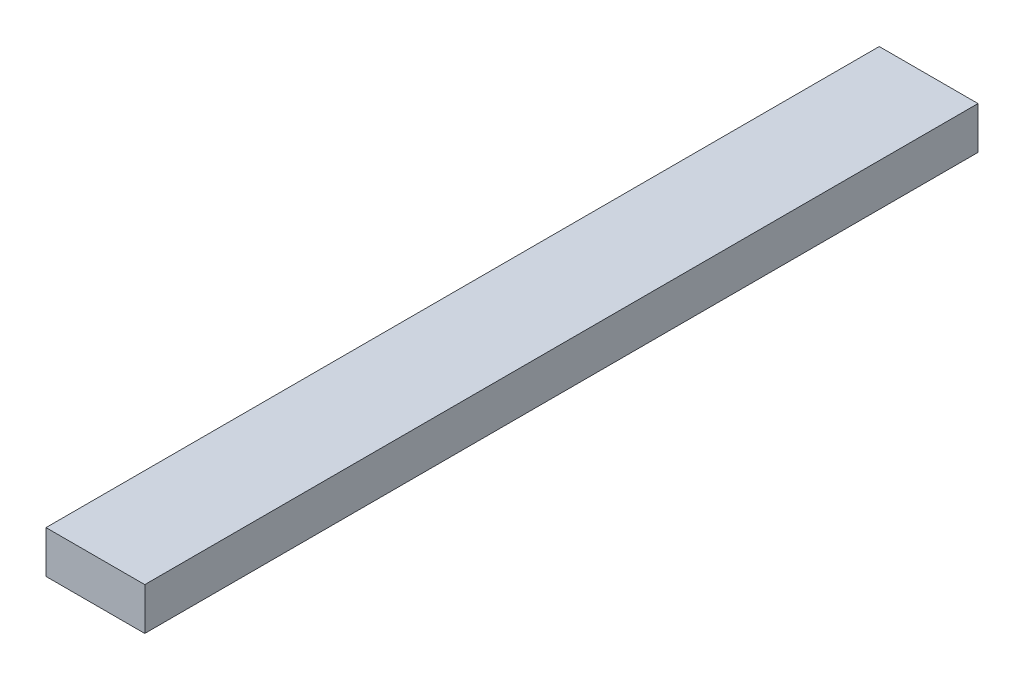
ISO-10303-21;
HEADER;
FILE_DESCRIPTION(('STEP AP214'),'2;1');
FILE_NAME('part.step','',(''),(''),'','','');
FILE_SCHEMA(('AUTOMOTIVE_DESIGN { 1 0 10303 214 1 1 1 1 }'));
ENDSEC;
DATA;
#1=APPLICATION_CONTEXT('core data for automotive mechanical design processes');
#2=APPLICATION_PROTOCOL_DEFINITION('international standard','automotive_design',2000,#1);
#3=PRODUCT_CONTEXT('',#1,'mechanical');
#4=PRODUCT('Part','Part','',(#3));
#5=PRODUCT_RELATED_PRODUCT_CATEGORY('part','',(#4));
#6=PRODUCT_DEFINITION_FORMATION('','',#4);
#7=PRODUCT_DEFINITION_CONTEXT('part definition',#1,'design');
#8=PRODUCT_DEFINITION('design','',#6,#7);
#9=PRODUCT_DEFINITION_SHAPE('','',#8);
#10=(LENGTH_UNIT() NAMED_UNIT(*) SI_UNIT(.MILLI.,.METRE.));
#11=(NAMED_UNIT(*) PLANE_ANGLE_UNIT() SI_UNIT($,.RADIAN.));
#12=(NAMED_UNIT(*) SI_UNIT($,.STERADIAN.) SOLID_ANGLE_UNIT());
#13=UNCERTAINTY_MEASURE_WITH_UNIT(LENGTH_MEASURE(1.E-05),#10,'distance_accuracy_value','');
#14=(GEOMETRIC_REPRESENTATION_CONTEXT(3) GLOBAL_UNCERTAINTY_ASSIGNED_CONTEXT((#13)) GLOBAL_UNIT_ASSIGNED_CONTEXT((#10,
#11,#12)) REPRESENTATION_CONTEXT('',''));
#15=CARTESIAN_POINT('',(0.,0.,0.));
#16=DIRECTION('',(0.,0.,1.));
#17=DIRECTION('',(1.,0.,0.));
#18=AXIS2_PLACEMENT_3D('',#15,#16,#17);
#19=CARTESIAN_POINT('',(44.45,-19.05,750.));
#20=DIRECTION('',(-1.,0.,0.));
#21=DIRECTION('',(0.,0.,1.));
#22=AXIS2_PLACEMENT_3D('',#19,#20,#21);
#23=PLANE('',#22);
#24=DIRECTION('',(0.,1.,0.));
#25=VECTOR('',#24,1.);
#26=CARTESIAN_POINT('',(44.45,-19.05,0.));
#27=LINE('',#26,#25);
#28=CARTESIAN_POINT('',(44.45,-19.05,0.));
#29=VERTEX_POINT('',#28);
#30=CARTESIAN_POINT('',(44.45,19.05,0.));
#31=VERTEX_POINT('',#30);
#32=EDGE_CURVE('E96',#29,#31,#27,.T.);
#33=ORIENTED_EDGE('',*,*,#32,.T.);
#34=DIRECTION('',(0.,0.,-1.));
#35=VECTOR('',#34,1.);
#36=CARTESIAN_POINT('',(44.45,19.05,750.));
#37=LINE('',#36,#35);
#38=CARTESIAN_POINT('',(44.45,19.05,750.));
#39=VERTEX_POINT('',#38);
#40=EDGE_CURVE('E11',#39,#31,#37,.T.);
#41=ORIENTED_EDGE('',*,*,#40,.F.);
#42=DIRECTION('',(0.,1.,0.));
#43=VECTOR('',#42,1.);
#44=CARTESIAN_POINT('',(44.45,-19.05,750.));
#45=LINE('',#44,#43);
#46=CARTESIAN_POINT('',(44.45,-19.05,750.));
#47=VERTEX_POINT('',#46);
#48=EDGE_CURVE('E84',#47,#39,#45,.T.);
#49=ORIENTED_EDGE('',*,*,#48,.F.);
#50=DIRECTION('',(0.,0.,-1.));
#51=VECTOR('',#50,1.);
#52=CARTESIAN_POINT('',(44.45,-19.05,750.));
#53=LINE('',#52,#51);
#54=EDGE_CURVE('E92',#47,#29,#53,.T.);
#55=ORIENTED_EDGE('',*,*,#54,.T.);
#56=EDGE_LOOP('',(#33,#41,#49,#55));
#57=FACE_BOUND('',#56,.T.);
#58=ADVANCED_FACE('F33',(#57),#23,.F.);
#59=CARTESIAN_POINT('',(-44.45,19.05,750.));
#60=DIRECTION('',(0.,-1.,0.));
#61=DIRECTION('',(0.,0.,-1.));
#62=AXIS2_PLACEMENT_3D('',#59,#60,#61);
#63=PLANE('',#62);
#64=DIRECTION('',(-1.,0.,0.));
#65=VECTOR('',#64,1.);
#66=CARTESIAN_POINT('',(-44.45,19.05,0.));
#67=LINE('',#66,#65);
#68=CARTESIAN_POINT('',(-44.45,19.05,0.));
#69=VERTEX_POINT('',#68);
#70=EDGE_CURVE('E88',#31,#69,#67,.T.);
#71=ORIENTED_EDGE('',*,*,#70,.T.);
#72=DIRECTION('',(0.,0.,-1.));
#73=VECTOR('',#72,1.);
#74=CARTESIAN_POINT('',(-44.45,19.05,750.));
#75=LINE('',#74,#73);
#76=CARTESIAN_POINT('',(-44.45,19.05,750.));
#77=VERTEX_POINT('',#76);
#78=EDGE_CURVE('E41',#77,#69,#75,.T.);
#79=ORIENTED_EDGE('',*,*,#78,.F.);
#80=DIRECTION('',(-1.,0.,0.));
#81=VECTOR('',#80,1.);
#82=CARTESIAN_POINT('',(-44.45,19.05,750.));
#83=LINE('',#82,#81);
#84=EDGE_CURVE('E79',#39,#77,#83,.T.);
#85=ORIENTED_EDGE('',*,*,#84,.F.);
#86=ORIENTED_EDGE('',*,*,#40,.T.);
#87=EDGE_LOOP('',(#71,#79,#85,#86));
#88=FACE_BOUND('',#87,.T.);
#89=ADVANCED_FACE('F87',(#88),#63,.F.);
#90=CARTESIAN_POINT('',(-44.45,-19.05,750.));
#91=DIRECTION('',(1.,0.,0.));
#92=DIRECTION('',(0.,0.,-1.));
#93=AXIS2_PLACEMENT_3D('',#90,#91,#92);
#94=PLANE('',#93);
#95=DIRECTION('',(0.,-1.,0.));
#96=VECTOR('',#95,1.);
#97=CARTESIAN_POINT('',(-44.45,-19.05,0.));
#98=LINE('',#97,#96);
#99=CARTESIAN_POINT('',(-44.45,-19.05,0.));
#100=VERTEX_POINT('',#99);
#101=EDGE_CURVE('E66',#69,#100,#98,.T.);
#102=ORIENTED_EDGE('',*,*,#101,.T.);
#103=DIRECTION('',(0.,0.,-1.));
#104=VECTOR('',#103,1.);
#105=CARTESIAN_POINT('',(-44.45,-19.05,750.));
#106=LINE('',#105,#104);
#107=CARTESIAN_POINT('',(-44.45,-19.05,750.));
#108=VERTEX_POINT('',#107);
#109=EDGE_CURVE('E89',#108,#100,#106,.T.);
#110=ORIENTED_EDGE('',*,*,#109,.F.);
#111=DIRECTION('',(0.,-1.,0.));
#112=VECTOR('',#111,1.);
#113=CARTESIAN_POINT('',(-44.45,-19.05,750.));
#114=LINE('',#113,#112);
#115=EDGE_CURVE('E82',#77,#108,#114,.T.);
#116=ORIENTED_EDGE('',*,*,#115,.F.);
#117=ORIENTED_EDGE('',*,*,#78,.T.);
#118=EDGE_LOOP('',(#102,#110,#116,#117));
#119=FACE_BOUND('',#118,.T.);
#120=ADVANCED_FACE('F90',(#119),#94,.F.);
#121=CARTESIAN_POINT('',(-44.45,-19.05,750.));
#122=DIRECTION('',(0.,1.,0.));
#123=DIRECTION('',(0.,0.,1.));
#124=AXIS2_PLACEMENT_3D('',#121,#122,#123);
#125=PLANE('',#124);
#126=DIRECTION('',(1.,0.,0.));
#127=VECTOR('',#126,1.);
#128=CARTESIAN_POINT('',(-44.45,-19.05,0.));
#129=LINE('',#128,#127);
#130=EDGE_CURVE('E72',#100,#29,#129,.T.);
#131=ORIENTED_EDGE('',*,*,#130,.T.);
#132=ORIENTED_EDGE('',*,*,#54,.F.);
#133=DIRECTION('',(1.,0.,0.));
#134=VECTOR('',#133,1.);
#135=CARTESIAN_POINT('',(-44.45,-19.05,750.));
#136=LINE('',#135,#134);
#137=EDGE_CURVE('E49',#108,#47,#136,.T.);
#138=ORIENTED_EDGE('',*,*,#137,.F.);
#139=ORIENTED_EDGE('',*,*,#109,.T.);
#140=EDGE_LOOP('',(#131,#132,#138,#139));
#141=FACE_BOUND('',#140,.T.);
#142=ADVANCED_FACE('F103',(#141),#125,.F.);
#143=CARTESIAN_POINT('',(0.,0.,750.));
#144=DIRECTION('',(0.,0.,-1.));
#145=DIRECTION('',(-1.,0.,0.));
#146=AXIS2_PLACEMENT_3D('',#143,#144,#145);
#147=PLANE('',#146);
#148=ORIENTED_EDGE('',*,*,#48,.T.);
#149=ORIENTED_EDGE('',*,*,#84,.T.);
#150=ORIENTED_EDGE('',*,*,#115,.T.);
#151=ORIENTED_EDGE('',*,*,#137,.T.);
#152=EDGE_LOOP('',(#148,#149,#150,#151));
#153=FACE_BOUND('',#152,.T.);
#154=ADVANCED_FACE('F80',(#153),#147,.F.);
#155=CARTESIAN_POINT('',(0.,0.,0.));
#156=DIRECTION('',(0.,0.,-1.));
#157=DIRECTION('',(-1.,0.,0.));
#158=AXIS2_PLACEMENT_3D('',#155,#156,#157);
#159=PLANE('',#158);
#160=ORIENTED_EDGE('',*,*,#32,.F.);
#161=ORIENTED_EDGE('',*,*,#130,.F.);
#162=ORIENTED_EDGE('',*,*,#101,.F.);
#163=ORIENTED_EDGE('',*,*,#70,.F.);
#164=EDGE_LOOP('',(#160,#161,#162,#163));
#165=FACE_BOUND('',#164,.T.);
#166=ADVANCED_FACE('F106',(#165),#159,.T.);
#167=CLOSED_SHELL('',(#58,#89,#120,#142,#154,#166));
#168=MANIFOLD_SOLID_BREP('B2',#167);
#169=ADVANCED_BREP_SHAPE_REPRESENTATION('',(#18,#168),#14);
#170=SHAPE_DEFINITION_REPRESENTATION(#9,#169);
ENDSEC;
END-ISO-10303-21;
